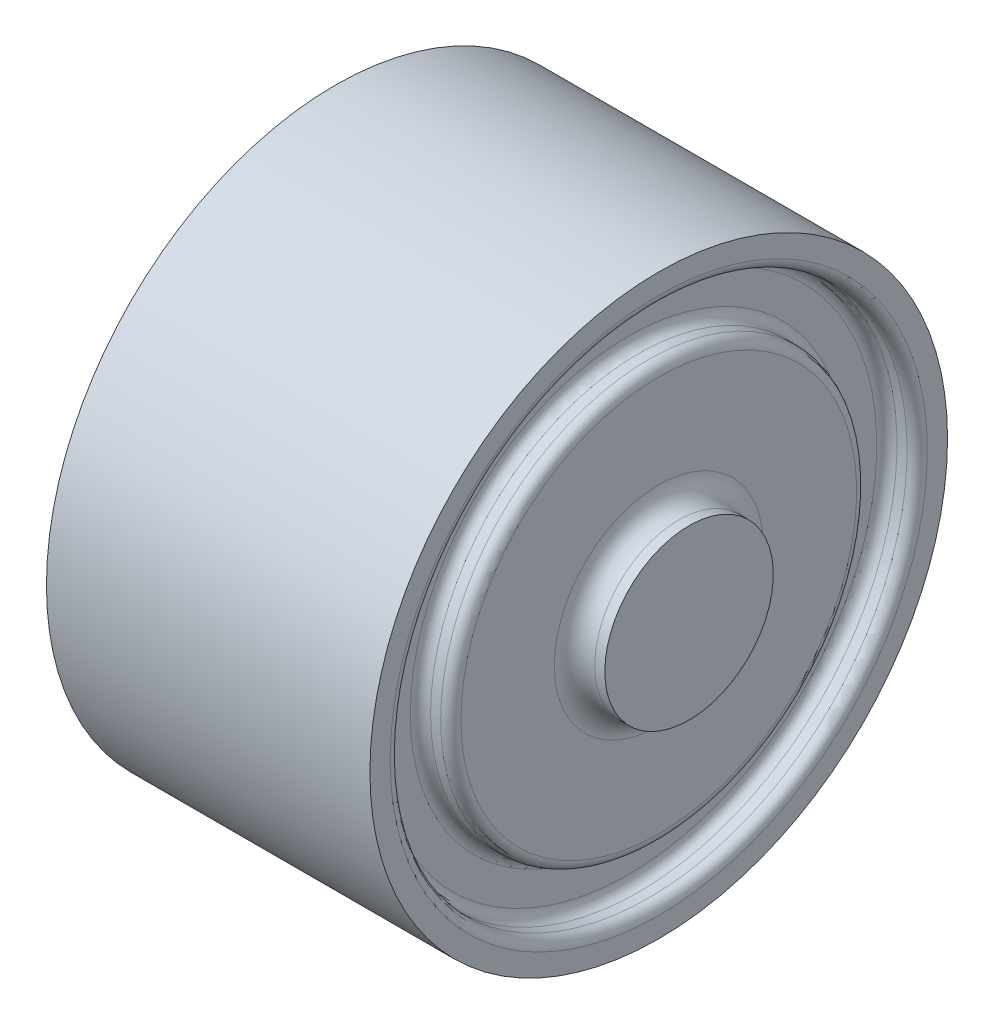
ISO-10303-21;
HEADER;
FILE_DESCRIPTION(('STEP AP214'),'2;1');
FILE_NAME('part.step','',(''),(''),'','','');
FILE_SCHEMA(('AUTOMOTIVE_DESIGN { 1 0 10303 214 1 1 1 1 }'));
ENDSEC;
DATA;
#1=APPLICATION_CONTEXT('core data for automotive mechanical design processes');
#2=APPLICATION_PROTOCOL_DEFINITION('international standard','automotive_design',2000,#1);
#3=PRODUCT_CONTEXT('',#1,'mechanical');
#4=PRODUCT('Part','Part','',(#3));
#5=PRODUCT_RELATED_PRODUCT_CATEGORY('part','',(#4));
#6=PRODUCT_DEFINITION_FORMATION('','',#4);
#7=PRODUCT_DEFINITION_CONTEXT('part definition',#1,'design');
#8=PRODUCT_DEFINITION('design','',#6,#7);
#9=PRODUCT_DEFINITION_SHAPE('','',#8);
#10=(LENGTH_UNIT() NAMED_UNIT(*) SI_UNIT(.MILLI.,.METRE.));
#11=(NAMED_UNIT(*) PLANE_ANGLE_UNIT() SI_UNIT($,.RADIAN.));
#12=(NAMED_UNIT(*) SI_UNIT($,.STERADIAN.) SOLID_ANGLE_UNIT());
#13=UNCERTAINTY_MEASURE_WITH_UNIT(LENGTH_MEASURE(1.E-05),#10,'distance_accuracy_value','');
#14=(GEOMETRIC_REPRESENTATION_CONTEXT(3) GLOBAL_UNCERTAINTY_ASSIGNED_CONTEXT((#13)) GLOBAL_UNIT_ASSIGNED_CONTEXT((#10,
#11,#12)) REPRESENTATION_CONTEXT('',''));
#15=CARTESIAN_POINT('',(0.,0.,0.));
#16=DIRECTION('',(0.,0.,1.));
#17=DIRECTION('',(1.,0.,0.));
#18=AXIS2_PLACEMENT_3D('',#15,#16,#17);
#19=CARTESIAN_POINT('',(19.,8.3333333333333,0.));
#20=DIRECTION('',(-1.,0.,0.));
#21=DIRECTION('',(0.,0.,1.));
#22=AXIS2_PLACEMENT_3D('',#19,#20,#21);
#23=PLANE('',#22);
#24=CARTESIAN_POINT('',(19.,0.,0.));
#25=DIRECTION('',(-1.,0.,0.));
#26=DIRECTION('',(0.,0.,1.));
#27=AXIS2_PLACEMENT_3D('',#24,#25,#26);
#28=CIRCLE('',#27,8.3333333333333);
#29=CARTESIAN_POINT('',(19.,0.,8.3333333333333));
#30=VERTEX_POINT('',#29);
#31=EDGE_CURVE('E10',#30,#30,#28,.T.);
#32=ORIENTED_EDGE('',*,*,#31,.F.);
#33=EDGE_LOOP('',(#32));
#34=FACE_BOUND('',#33,.T.);
#35=ADVANCED_FACE('F32',(#34),#23,.F.);
#36=CARTESIAN_POINT('',(19.,0.,0.));
#37=DIRECTION('',(-1.,0.,0.));
#38=DIRECTION('',(0.,0.,1.));
#39=AXIS2_PLACEMENT_3D('',#36,#37,#38);
#40=CYLINDRICAL_SURFACE('',#39,8.3333333333333);
#41=CARTESIAN_POINT('',(18.,0.,0.));
#42=DIRECTION('',(-1.,0.,0.));
#43=DIRECTION('',(0.,0.,1.));
#44=AXIS2_PLACEMENT_3D('',#41,#42,#43);
#45=CIRCLE('',#44,8.3333333333333);
#46=CARTESIAN_POINT('',(18.,0.,8.3333333333333));
#47=VERTEX_POINT('',#46);
#48=EDGE_CURVE('E38',#47,#47,#45,.T.);
#49=ORIENTED_EDGE('',*,*,#48,.F.);
#50=EDGE_LOOP('',(#49));
#51=FACE_BOUND('',#50,.T.);
#52=ORIENTED_EDGE('',*,*,#31,.T.);
#53=EDGE_LOOP('',(#52));
#54=FACE_BOUND('',#53,.T.);
#55=ADVANCED_FACE('F242',(#51,#54),#40,.T.);
#56=CARTESIAN_POINT('',(18.0000000000002,0.,0.));
#57=DIRECTION('',(-1.,0.,0.));
#58=DIRECTION('',(0.,0.,1.));
#59=AXIS2_PLACEMENT_3D('',#56,#57,#58);
#60=TOROIDAL_SURFACE('',#59,10.3333333333335,2.00000000000015);
#61=CARTESIAN_POINT('',(16.,0.,0.));
#62=DIRECTION('',(-1.,0.,0.));
#63=DIRECTION('',(0.,0.,1.));
#64=AXIS2_PLACEMENT_3D('',#61,#62,#63);
#65=CIRCLE('',#64,10.333333333333);
#66=CARTESIAN_POINT('',(16.,0.,10.333333333333));
#67=VERTEX_POINT('',#66);
#68=EDGE_CURVE('E42',#67,#67,#65,.T.);
#69=ORIENTED_EDGE('',*,*,#68,.F.);
#70=EDGE_LOOP('',(#69));
#71=FACE_BOUND('',#70,.T.);
#72=ORIENTED_EDGE('',*,*,#48,.T.);
#73=EDGE_LOOP('',(#72));
#74=FACE_BOUND('',#73,.T.);
#75=ADVANCED_FACE('F237',(#71,#74),#60,.F.);
#76=CARTESIAN_POINT('',(16.,19.571428571429,0.));
#77=DIRECTION('',(-1.,0.,0.));
#78=DIRECTION('',(0.,0.,1.));
#79=AXIS2_PLACEMENT_3D('',#76,#77,#78);
#80=PLANE('',#79);
#81=CARTESIAN_POINT('',(16.,0.,0.));
#82=DIRECTION('',(-1.,0.,0.));
#83=DIRECTION('',(0.,0.,1.));
#84=AXIS2_PLACEMENT_3D('',#81,#82,#83);
#85=CIRCLE('',#84,19.571428571429);
#86=CARTESIAN_POINT('',(16.,0.,19.571428571429));
#87=VERTEX_POINT('',#86);
#88=EDGE_CURVE('E46',#87,#87,#85,.T.);
#89=ORIENTED_EDGE('',*,*,#88,.F.);
#90=EDGE_LOOP('',(#89));
#91=FACE_BOUND('',#90,.T.);
#92=ORIENTED_EDGE('',*,*,#68,.T.);
#93=EDGE_LOOP('',(#92));
#94=FACE_BOUND('',#93,.T.);
#95=ADVANCED_FACE('F231',(#91,#94),#80,.F.);
#96=CARTESIAN_POINT('',(14.9999999999998,0.,0.));
#97=DIRECTION('',(-1.,0.,0.));
#98=DIRECTION('',(0.,0.,1.));
#99=AXIS2_PLACEMENT_3D('',#96,#97,#98);
#100=TOROIDAL_SURFACE('',#99,19.5714285714288,1.00000000000016);
#101=CARTESIAN_POINT('',(15.,0.,0.));
#102=DIRECTION('',(-1.,0.,0.));
#103=DIRECTION('',(0.,0.,1.));
#104=AXIS2_PLACEMENT_3D('',#101,#102,#103);
#105=CIRCLE('',#104,20.571428571429);
#106=CARTESIAN_POINT('',(15.,0.,20.571428571429));
#107=VERTEX_POINT('',#106);
#108=EDGE_CURVE('E51',#107,#107,#105,.T.);
#109=ORIENTED_EDGE('',*,*,#108,.F.);
#110=EDGE_LOOP('',(#109));
#111=FACE_BOUND('',#110,.T.);
#112=ORIENTED_EDGE('',*,*,#88,.T.);
#113=EDGE_LOOP('',(#112));
#114=FACE_BOUND('',#113,.T.);
#115=ADVANCED_FACE('F225',(#111,#114),#100,.T.);
#116=CARTESIAN_POINT('',(19.,0.,0.));
#117=DIRECTION('',(-1.,0.,0.));
#118=DIRECTION('',(0.,0.,1.));
#119=AXIS2_PLACEMENT_3D('',#116,#117,#118);
#120=CYLINDRICAL_SURFACE('',#119,20.571428571429);
#121=CARTESIAN_POINT('',(14.,0.,0.));
#122=DIRECTION('',(-1.,0.,0.));
#123=DIRECTION('',(0.,0.,1.));
#124=AXIS2_PLACEMENT_3D('',#121,#122,#123);
#125=CIRCLE('',#124,20.571428571429);
#126=CARTESIAN_POINT('',(14.,0.,20.571428571429));
#127=VERTEX_POINT('',#126);
#128=EDGE_CURVE('E54',#127,#127,#125,.T.);
#129=ORIENTED_EDGE('',*,*,#128,.F.);
#130=EDGE_LOOP('',(#129));
#131=FACE_BOUND('',#130,.T.);
#132=ORIENTED_EDGE('',*,*,#108,.T.);
#133=EDGE_LOOP('',(#132));
#134=FACE_BOUND('',#133,.T.);
#135=ADVANCED_FACE('F219',(#131,#134),#120,.T.);
#136=CARTESIAN_POINT('',(13.9999999999985,0.,0.));
#137=DIRECTION('',(-1.,0.,0.));
#138=DIRECTION('',(0.,0.,1.));
#139=AXIS2_PLACEMENT_3D('',#136,#137,#138);
#140=TOROIDAL_SURFACE('',#139,21.5714285714275,0.999999999998454);
#141=CARTESIAN_POINT('',(13.,0.,0.));
#142=DIRECTION('',(-1.,0.,0.));
#143=DIRECTION('',(0.,0.,1.));
#144=AXIS2_PLACEMENT_3D('',#141,#142,#143);
#145=CIRCLE('',#144,21.571428571429);
#146=CARTESIAN_POINT('',(13.,0.,21.571428571429));
#147=VERTEX_POINT('',#146);
#148=EDGE_CURVE('E57',#147,#147,#145,.T.);
#149=ORIENTED_EDGE('',*,*,#148,.F.);
#150=EDGE_LOOP('',(#149));
#151=FACE_BOUND('',#150,.T.);
#152=ORIENTED_EDGE('',*,*,#128,.T.);
#153=EDGE_LOOP('',(#152));
#154=FACE_BOUND('',#153,.T.);
#155=ADVANCED_FACE('F213',(#151,#154),#140,.F.);
#156=CARTESIAN_POINT('',(13.,24.571428571429,0.));
#157=DIRECTION('',(-1.,0.,0.));
#158=DIRECTION('',(0.,0.,1.));
#159=AXIS2_PLACEMENT_3D('',#156,#157,#158);
#160=PLANE('',#159);
#161=CARTESIAN_POINT('',(13.,0.,0.));
#162=DIRECTION('',(-1.,0.,0.));
#163=DIRECTION('',(0.,0.,1.));
#164=AXIS2_PLACEMENT_3D('',#161,#162,#163);
#165=CIRCLE('',#164,24.571428571429);
#166=CARTESIAN_POINT('',(13.,0.,24.571428571429));
#167=VERTEX_POINT('',#166);
#168=EDGE_CURVE('E60',#167,#167,#165,.T.);
#169=ORIENTED_EDGE('',*,*,#168,.F.);
#170=EDGE_LOOP('',(#169));
#171=FACE_BOUND('',#170,.T.);
#172=ORIENTED_EDGE('',*,*,#148,.T.);
#173=EDGE_LOOP('',(#172));
#174=FACE_BOUND('',#173,.T.);
#175=ADVANCED_FACE('F207',(#171,#174),#160,.F.);
#176=CARTESIAN_POINT('',(14.0000000000002,0.,0.));
#177=DIRECTION('',(-1.,0.,0.));
#178=DIRECTION('',(0.,0.,1.));
#179=AXIS2_PLACEMENT_3D('',#176,#177,#178);
#180=TOROIDAL_SURFACE('',#179,24.5714285714288,1.00000000000017);
#181=CARTESIAN_POINT('',(14.,0.,0.));
#182=DIRECTION('',(-1.,0.,0.));
#183=DIRECTION('',(0.,0.,1.));
#184=AXIS2_PLACEMENT_3D('',#181,#182,#183);
#185=CIRCLE('',#184,25.571428571429);
#186=CARTESIAN_POINT('',(14.,0.,25.571428571429));
#187=VERTEX_POINT('',#186);
#188=EDGE_CURVE('E63',#187,#187,#185,.T.);
#189=ORIENTED_EDGE('',*,*,#188,.F.);
#190=EDGE_LOOP('',(#189));
#191=FACE_BOUND('',#190,.T.);
#192=ORIENTED_EDGE('',*,*,#168,.T.);
#193=EDGE_LOOP('',(#192));
#194=FACE_BOUND('',#193,.T.);
#195=ADVANCED_FACE('F201',(#191,#194),#180,.F.);
#196=CARTESIAN_POINT('',(19.,0.,0.));
#197=DIRECTION('',(-1.,0.,0.));
#198=DIRECTION('',(0.,0.,1.));
#199=AXIS2_PLACEMENT_3D('',#196,#197,#198);
#200=CYLINDRICAL_SURFACE('',#199,25.571428571429);
#201=CARTESIAN_POINT('',(15.,0.,0.));
#202=DIRECTION('',(-1.,0.,0.));
#203=DIRECTION('',(0.,0.,1.));
#204=AXIS2_PLACEMENT_3D('',#201,#202,#203);
#205=CIRCLE('',#204,25.571428571429);
#206=CARTESIAN_POINT('',(15.,0.,25.571428571429));
#207=VERTEX_POINT('',#206);
#208=EDGE_CURVE('E66',#207,#207,#205,.T.);
#209=ORIENTED_EDGE('',*,*,#208,.F.);
#210=EDGE_LOOP('',(#209));
#211=FACE_BOUND('',#210,.T.);
#212=ORIENTED_EDGE('',*,*,#188,.T.);
#213=EDGE_LOOP('',(#212));
#214=FACE_BOUND('',#213,.T.);
#215=ADVANCED_FACE('F195',(#211,#214),#200,.F.);
#216=CARTESIAN_POINT('',(15.0000000000015,0.,0.));
#217=DIRECTION('',(-1.,0.,0.));
#218=DIRECTION('',(0.,0.,1.));
#219=AXIS2_PLACEMENT_3D('',#216,#217,#218);
#220=TOROIDAL_SURFACE('',#219,26.5714285714275,0.999999999998456);
#221=CARTESIAN_POINT('',(16.,0.,0.));
#222=DIRECTION('',(-1.,0.,0.));
#223=DIRECTION('',(0.,0.,1.));
#224=AXIS2_PLACEMENT_3D('',#221,#222,#223);
#225=CIRCLE('',#224,26.571428571429);
#226=CARTESIAN_POINT('',(16.,0.,26.571428571429));
#227=VERTEX_POINT('',#226);
#228=EDGE_CURVE('E69',#227,#227,#225,.T.);
#229=ORIENTED_EDGE('',*,*,#228,.F.);
#230=EDGE_LOOP('',(#229));
#231=FACE_BOUND('',#230,.T.);
#232=ORIENTED_EDGE('',*,*,#208,.T.);
#233=EDGE_LOOP('',(#232));
#234=FACE_BOUND('',#233,.T.);
#235=ADVANCED_FACE('F189',(#231,#234),#220,.T.);
#236=CARTESIAN_POINT('',(16.,28.571428571429,0.));
#237=DIRECTION('',(-1.,0.,0.));
#238=DIRECTION('',(0.,0.,1.));
#239=AXIS2_PLACEMENT_3D('',#236,#237,#238);
#240=PLANE('',#239);
#241=CARTESIAN_POINT('',(16.,0.,0.));
#242=DIRECTION('',(-1.,0.,0.));
#243=DIRECTION('',(0.,0.,1.));
#244=AXIS2_PLACEMENT_3D('',#241,#242,#243);
#245=CIRCLE('',#244,28.571428571429);
#246=CARTESIAN_POINT('',(16.,0.,28.571428571429));
#247=VERTEX_POINT('',#246);
#248=EDGE_CURVE('E72',#247,#247,#245,.T.);
#249=ORIENTED_EDGE('',*,*,#248,.F.);
#250=EDGE_LOOP('',(#249));
#251=FACE_BOUND('',#250,.T.);
#252=ORIENTED_EDGE('',*,*,#228,.T.);
#253=EDGE_LOOP('',(#252));
#254=FACE_BOUND('',#253,.T.);
#255=ADVANCED_FACE('F183',(#251,#254),#240,.F.);
#256=CARTESIAN_POINT('',(19.,0.,0.));
#257=DIRECTION('',(-1.,0.,0.));
#258=DIRECTION('',(0.,0.,1.));
#259=AXIS2_PLACEMENT_3D('',#256,#257,#258);
#260=CYLINDRICAL_SURFACE('',#259,28.571428571429);
#261=CARTESIAN_POINT('',(-16.,0.,0.));
#262=DIRECTION('',(-1.,0.,0.));
#263=DIRECTION('',(0.,0.,1.));
#264=AXIS2_PLACEMENT_3D('',#261,#262,#263);
#265=CIRCLE('',#264,28.571428571429);
#266=CARTESIAN_POINT('',(-16.,0.,28.571428571429));
#267=VERTEX_POINT('',#266);
#268=EDGE_CURVE('E75',#267,#267,#265,.T.);
#269=ORIENTED_EDGE('',*,*,#268,.F.);
#270=EDGE_LOOP('',(#269));
#271=FACE_BOUND('',#270,.T.);
#272=ORIENTED_EDGE('',*,*,#248,.T.);
#273=EDGE_LOOP('',(#272));
#274=FACE_BOUND('',#273,.T.);
#275=ADVANCED_FACE('F177',(#271,#274),#260,.T.);
#276=CARTESIAN_POINT('',(-16.,26.571428571429,0.));
#277=DIRECTION('',(1.,0.,0.));
#278=DIRECTION('',(0.,0.,-1.));
#279=AXIS2_PLACEMENT_3D('',#276,#277,#278);
#280=PLANE('',#279);
#281=CARTESIAN_POINT('',(-16.,0.,0.));
#282=DIRECTION('',(-1.,0.,0.));
#283=DIRECTION('',(0.,0.,1.));
#284=AXIS2_PLACEMENT_3D('',#281,#282,#283);
#285=CIRCLE('',#284,26.571428571429);
#286=CARTESIAN_POINT('',(-16.,0.,26.571428571429));
#287=VERTEX_POINT('',#286);
#288=EDGE_CURVE('E78',#287,#287,#285,.T.);
#289=ORIENTED_EDGE('',*,*,#288,.F.);
#290=EDGE_LOOP('',(#289));
#291=FACE_BOUND('',#290,.T.);
#292=ORIENTED_EDGE('',*,*,#268,.T.);
#293=EDGE_LOOP('',(#292));
#294=FACE_BOUND('',#293,.T.);
#295=ADVANCED_FACE('F171',(#291,#294),#280,.F.);
#296=CARTESIAN_POINT('',(-15.0000000000015,0.,0.));
#297=DIRECTION('',(-1.,0.,0.));
#298=DIRECTION('',(0.,0.,1.));
#299=AXIS2_PLACEMENT_3D('',#296,#297,#298);
#300=TOROIDAL_SURFACE('',#299,26.5714285714275,0.999999999998457);
#301=CARTESIAN_POINT('',(-15.,0.,0.));
#302=DIRECTION('',(-1.,0.,0.));
#303=DIRECTION('',(0.,0.,1.));
#304=AXIS2_PLACEMENT_3D('',#301,#302,#303);
#305=CIRCLE('',#304,25.571428571429);
#306=CARTESIAN_POINT('',(-15.,0.,25.571428571429));
#307=VERTEX_POINT('',#306);
#308=EDGE_CURVE('E81',#307,#307,#305,.T.);
#309=ORIENTED_EDGE('',*,*,#308,.F.);
#310=EDGE_LOOP('',(#309));
#311=FACE_BOUND('',#310,.T.);
#312=ORIENTED_EDGE('',*,*,#288,.T.);
#313=EDGE_LOOP('',(#312));
#314=FACE_BOUND('',#313,.T.);
#315=ADVANCED_FACE('F165',(#311,#314),#300,.T.);
#316=CARTESIAN_POINT('',(19.,0.,0.));
#317=DIRECTION('',(-1.,0.,0.));
#318=DIRECTION('',(0.,0.,1.));
#319=AXIS2_PLACEMENT_3D('',#316,#317,#318);
#320=CYLINDRICAL_SURFACE('',#319,25.571428571429);
#321=CARTESIAN_POINT('',(-14.,0.,0.));
#322=DIRECTION('',(-1.,0.,0.));
#323=DIRECTION('',(0.,0.,1.));
#324=AXIS2_PLACEMENT_3D('',#321,#322,#323);
#325=CIRCLE('',#324,25.571428571429);
#326=CARTESIAN_POINT('',(-14.,0.,25.571428571429));
#327=VERTEX_POINT('',#326);
#328=EDGE_CURVE('E84',#327,#327,#325,.T.);
#329=ORIENTED_EDGE('',*,*,#328,.F.);
#330=EDGE_LOOP('',(#329));
#331=FACE_BOUND('',#330,.T.);
#332=ORIENTED_EDGE('',*,*,#308,.T.);
#333=EDGE_LOOP('',(#332));
#334=FACE_BOUND('',#333,.T.);
#335=ADVANCED_FACE('F159',(#331,#334),#320,.F.);
#336=CARTESIAN_POINT('',(-14.0000000000002,0.,0.));
#337=DIRECTION('',(-1.,0.,0.));
#338=DIRECTION('',(0.,0.,1.));
#339=AXIS2_PLACEMENT_3D('',#336,#337,#338);
#340=TOROIDAL_SURFACE('',#339,24.5714285714288,1.00000000000016);
#341=CARTESIAN_POINT('',(-13.,0.,0.));
#342=DIRECTION('',(-1.,0.,0.));
#343=DIRECTION('',(0.,0.,1.));
#344=AXIS2_PLACEMENT_3D('',#341,#342,#343);
#345=CIRCLE('',#344,24.571428571429);
#346=CARTESIAN_POINT('',(-13.,0.,24.571428571429));
#347=VERTEX_POINT('',#346);
#348=EDGE_CURVE('E87',#347,#347,#345,.T.);
#349=ORIENTED_EDGE('',*,*,#348,.F.);
#350=EDGE_LOOP('',(#349));
#351=FACE_BOUND('',#350,.T.);
#352=ORIENTED_EDGE('',*,*,#328,.T.);
#353=EDGE_LOOP('',(#352));
#354=FACE_BOUND('',#353,.T.);
#355=ADVANCED_FACE('F153',(#351,#354),#340,.F.);
#356=CARTESIAN_POINT('',(-13.,21.571428571429,0.));
#357=DIRECTION('',(1.,0.,0.));
#358=DIRECTION('',(0.,0.,-1.));
#359=AXIS2_PLACEMENT_3D('',#356,#357,#358);
#360=PLANE('',#359);
#361=CARTESIAN_POINT('',(-13.,0.,0.));
#362=DIRECTION('',(-1.,0.,0.));
#363=DIRECTION('',(0.,0.,1.));
#364=AXIS2_PLACEMENT_3D('',#361,#362,#363);
#365=CIRCLE('',#364,21.571428571429);
#366=CARTESIAN_POINT('',(-13.,0.,21.571428571429));
#367=VERTEX_POINT('',#366);
#368=EDGE_CURVE('E90',#367,#367,#365,.T.);
#369=ORIENTED_EDGE('',*,*,#368,.F.);
#370=EDGE_LOOP('',(#369));
#371=FACE_BOUND('',#370,.T.);
#372=ORIENTED_EDGE('',*,*,#348,.T.);
#373=EDGE_LOOP('',(#372));
#374=FACE_BOUND('',#373,.T.);
#375=ADVANCED_FACE('F147',(#371,#374),#360,.F.);
#376=CARTESIAN_POINT('',(-13.9999999999985,0.,0.));
#377=DIRECTION('',(-1.,0.,0.));
#378=DIRECTION('',(0.,0.,1.));
#379=AXIS2_PLACEMENT_3D('',#376,#377,#378);
#380=TOROIDAL_SURFACE('',#379,21.5714285714275,0.999999999998454);
#381=CARTESIAN_POINT('',(-14.,0.,0.));
#382=DIRECTION('',(-1.,0.,0.));
#383=DIRECTION('',(0.,0.,1.));
#384=AXIS2_PLACEMENT_3D('',#381,#382,#383);
#385=CIRCLE('',#384,20.571428571429);
#386=CARTESIAN_POINT('',(-14.,0.,20.571428571429));
#387=VERTEX_POINT('',#386);
#388=EDGE_CURVE('E93',#387,#387,#385,.T.);
#389=ORIENTED_EDGE('',*,*,#388,.F.);
#390=EDGE_LOOP('',(#389));
#391=FACE_BOUND('',#390,.T.);
#392=ORIENTED_EDGE('',*,*,#368,.T.);
#393=EDGE_LOOP('',(#392));
#394=FACE_BOUND('',#393,.T.);
#395=ADVANCED_FACE('F141',(#391,#394),#380,.F.);
#396=CARTESIAN_POINT('',(19.,0.,0.));
#397=DIRECTION('',(-1.,0.,0.));
#398=DIRECTION('',(0.,0.,1.));
#399=AXIS2_PLACEMENT_3D('',#396,#397,#398);
#400=CYLINDRICAL_SURFACE('',#399,20.571428571429);
#401=CARTESIAN_POINT('',(-15.,0.,0.));
#402=DIRECTION('',(-1.,0.,0.));
#403=DIRECTION('',(0.,0.,1.));
#404=AXIS2_PLACEMENT_3D('',#401,#402,#403);
#405=CIRCLE('',#404,20.571428571429);
#406=CARTESIAN_POINT('',(-15.,0.,20.571428571429));
#407=VERTEX_POINT('',#406);
#408=EDGE_CURVE('E96',#407,#407,#405,.T.);
#409=ORIENTED_EDGE('',*,*,#408,.F.);
#410=EDGE_LOOP('',(#409));
#411=FACE_BOUND('',#410,.T.);
#412=ORIENTED_EDGE('',*,*,#388,.T.);
#413=EDGE_LOOP('',(#412));
#414=FACE_BOUND('',#413,.T.);
#415=ADVANCED_FACE('F135',(#411,#414),#400,.T.);
#416=CARTESIAN_POINT('',(-14.9999999999998,0.,0.));
#417=DIRECTION('',(-1.,0.,0.));
#418=DIRECTION('',(0.,0.,1.));
#419=AXIS2_PLACEMENT_3D('',#416,#417,#418);
#420=TOROIDAL_SURFACE('',#419,19.5714285714288,1.00000000000017);
#421=CARTESIAN_POINT('',(-16.,0.,0.));
#422=DIRECTION('',(-1.,0.,0.));
#423=DIRECTION('',(0.,0.,1.));
#424=AXIS2_PLACEMENT_3D('',#421,#422,#423);
#425=CIRCLE('',#424,19.571428571429);
#426=CARTESIAN_POINT('',(-16.,0.,19.571428571429));
#427=VERTEX_POINT('',#426);
#428=EDGE_CURVE('E99',#427,#427,#425,.T.);
#429=ORIENTED_EDGE('',*,*,#428,.F.);
#430=EDGE_LOOP('',(#429));
#431=FACE_BOUND('',#430,.T.);
#432=ORIENTED_EDGE('',*,*,#408,.T.);
#433=EDGE_LOOP('',(#432));
#434=FACE_BOUND('',#433,.T.);
#435=ADVANCED_FACE('F129',(#431,#434),#420,.T.);
#436=CARTESIAN_POINT('',(-16.,10.333333333333,0.));
#437=DIRECTION('',(1.,0.,0.));
#438=DIRECTION('',(0.,0.,-1.));
#439=AXIS2_PLACEMENT_3D('',#436,#437,#438);
#440=PLANE('',#439);
#441=CARTESIAN_POINT('',(-16.,0.,0.));
#442=DIRECTION('',(-1.,0.,0.));
#443=DIRECTION('',(0.,0.,1.));
#444=AXIS2_PLACEMENT_3D('',#441,#442,#443);
#445=CIRCLE('',#444,10.333333333333);
#446=CARTESIAN_POINT('',(-16.,0.,10.333333333333));
#447=VERTEX_POINT('',#446);
#448=EDGE_CURVE('E102',#447,#447,#445,.T.);
#449=ORIENTED_EDGE('',*,*,#448,.F.);
#450=EDGE_LOOP('',(#449));
#451=FACE_BOUND('',#450,.T.);
#452=ORIENTED_EDGE('',*,*,#428,.T.);
#453=EDGE_LOOP('',(#452));
#454=FACE_BOUND('',#453,.T.);
#455=ADVANCED_FACE('F123',(#451,#454),#440,.F.);
#456=CARTESIAN_POINT('',(-18.0000000000001,0.,0.));
#457=DIRECTION('',(-1.,0.,0.));
#458=DIRECTION('',(0.,0.,1.));
#459=AXIS2_PLACEMENT_3D('',#456,#457,#458);
#460=TOROIDAL_SURFACE('',#459,10.3333333333334,2.00000000000015);
#461=CARTESIAN_POINT('',(-18.,0.,0.));
#462=DIRECTION('',(-1.,0.,0.));
#463=DIRECTION('',(0.,0.,1.));
#464=AXIS2_PLACEMENT_3D('',#461,#462,#463);
#465=CIRCLE('',#464,8.3333333333333);
#466=CARTESIAN_POINT('',(-18.,0.,8.3333333333333));
#467=VERTEX_POINT('',#466);
#468=EDGE_CURVE('E105',#467,#467,#465,.T.);
#469=ORIENTED_EDGE('',*,*,#468,.F.);
#470=EDGE_LOOP('',(#469));
#471=FACE_BOUND('',#470,.T.);
#472=ORIENTED_EDGE('',*,*,#448,.T.);
#473=EDGE_LOOP('',(#472));
#474=FACE_BOUND('',#473,.T.);
#475=ADVANCED_FACE('F117',(#471,#474),#460,.F.);
#476=CARTESIAN_POINT('',(19.,0.,0.));
#477=DIRECTION('',(-1.,0.,0.));
#478=DIRECTION('',(0.,0.,1.));
#479=AXIS2_PLACEMENT_3D('',#476,#477,#478);
#480=CYLINDRICAL_SURFACE('',#479,8.3333333333333);
#481=CARTESIAN_POINT('',(-19.,0.,0.));
#482=DIRECTION('',(-1.,0.,0.));
#483=DIRECTION('',(0.,0.,1.));
#484=AXIS2_PLACEMENT_3D('',#481,#482,#483);
#485=CIRCLE('',#484,8.3333333333333);
#486=CARTESIAN_POINT('',(-19.,0.,8.3333333333333));
#487=VERTEX_POINT('',#486);
#488=EDGE_CURVE('E108',#487,#487,#485,.T.);
#489=ORIENTED_EDGE('',*,*,#488,.F.);
#490=EDGE_LOOP('',(#489));
#491=FACE_BOUND('',#490,.T.);
#492=ORIENTED_EDGE('',*,*,#468,.T.);
#493=EDGE_LOOP('',(#492));
#494=FACE_BOUND('',#493,.T.);
#495=ADVANCED_FACE('F114',(#491,#494),#480,.T.);
#496=CARTESIAN_POINT('',(-19.,0.,0.));
#497=DIRECTION('',(1.,0.,0.));
#498=DIRECTION('',(0.,0.,-1.));
#499=AXIS2_PLACEMENT_3D('',#496,#497,#498);
#500=PLANE('',#499);
#501=ORIENTED_EDGE('',*,*,#488,.T.);
#502=EDGE_LOOP('',(#501));
#503=FACE_BOUND('',#502,.T.);
#504=ADVANCED_FACE('F112',(#503),#500,.F.);
#505=CLOSED_SHELL('',(#35,#55,#75,#95,#115,#135,#155,#175,#195,#215,#235,#255,#275,#295,#315,
#335,#355,#375,#395,#415,#435,#455,#475,#495,#504));
#506=MANIFOLD_SOLID_BREP('B2',#505);
#507=ADVANCED_BREP_SHAPE_REPRESENTATION('',(#18,#506),#14);
#508=SHAPE_DEFINITION_REPRESENTATION(#9,#507);
ENDSEC;
END-ISO-10303-21;
